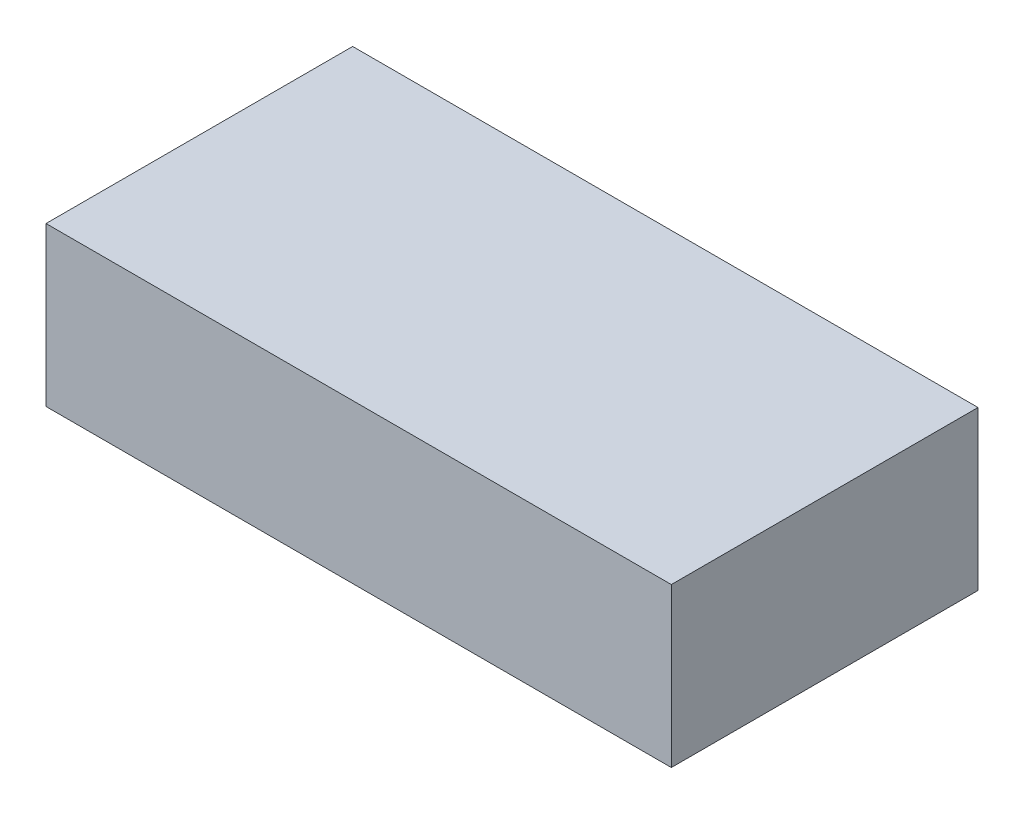
ISO-10303-21;
HEADER;
FILE_DESCRIPTION(('STEP AP214'),'2;1');
FILE_NAME('part.step','',(''),(''),'','','');
FILE_SCHEMA(('AUTOMOTIVE_DESIGN { 1 0 10303 214 1 1 1 1 }'));
ENDSEC;
DATA;
#1=APPLICATION_CONTEXT('core data for automotive mechanical design processes');
#2=APPLICATION_PROTOCOL_DEFINITION('international standard','automotive_design',2000,#1);
#3=PRODUCT_CONTEXT('',#1,'mechanical');
#4=PRODUCT('Part','Part','',(#3));
#5=PRODUCT_RELATED_PRODUCT_CATEGORY('part','',(#4));
#6=PRODUCT_DEFINITION_FORMATION('','',#4);
#7=PRODUCT_DEFINITION_CONTEXT('part definition',#1,'design');
#8=PRODUCT_DEFINITION('design','',#6,#7);
#9=PRODUCT_DEFINITION_SHAPE('','',#8);
#10=(LENGTH_UNIT() NAMED_UNIT(*) SI_UNIT(.MILLI.,.METRE.));
#11=(NAMED_UNIT(*) PLANE_ANGLE_UNIT() SI_UNIT($,.RADIAN.));
#12=(NAMED_UNIT(*) SI_UNIT($,.STERADIAN.) SOLID_ANGLE_UNIT());
#13=UNCERTAINTY_MEASURE_WITH_UNIT(LENGTH_MEASURE(1.E-05),#10,'distance_accuracy_value','');
#14=(GEOMETRIC_REPRESENTATION_CONTEXT(3) GLOBAL_UNCERTAINTY_ASSIGNED_CONTEXT((#13)) GLOBAL_UNIT_ASSIGNED_CONTEXT((#10,
#11,#12)) REPRESENTATION_CONTEXT('',''));
#15=CARTESIAN_POINT('',(0.,0.,0.));
#16=DIRECTION('',(0.,0.,1.));
#17=DIRECTION('',(1.,0.,0.));
#18=AXIS2_PLACEMENT_3D('',#15,#16,#17);
#19=CARTESIAN_POINT('',(-59.1844129893904,30.,-29.0243389926648));
#20=DIRECTION('',(1.,0.,0.));
#21=DIRECTION('',(0.,0.,-1.));
#22=AXIS2_PLACEMENT_3D('',#19,#20,#21);
#23=PLANE('',#22);
#24=DIRECTION('',(0.,0.,1.));
#25=VECTOR('',#24,1.);
#26=CARTESIAN_POINT('',(-59.1844129893904,0.,-29.0243389926648));
#27=LINE('',#26,#25);
#28=CARTESIAN_POINT('',(-59.1844129893904,0.,-29.0243389926648));
#29=VERTEX_POINT('',#28);
#30=CARTESIAN_POINT('',(-59.1844129893904,0.,29.0243389926648));
#31=VERTEX_POINT('',#30);
#32=EDGE_CURVE('E96',#29,#31,#27,.T.);
#33=ORIENTED_EDGE('',*,*,#32,.T.);
#34=DIRECTION('',(0.,-1.,0.));
#35=VECTOR('',#34,1.);
#36=CARTESIAN_POINT('',(-59.1844129893904,30.,29.0243389926648));
#37=LINE('',#36,#35);
#38=CARTESIAN_POINT('',(-59.1844129893904,30.,29.0243389926648));
#39=VERTEX_POINT('',#38);
#40=EDGE_CURVE('E11',#39,#31,#37,.T.);
#41=ORIENTED_EDGE('',*,*,#40,.F.);
#42=DIRECTION('',(0.,0.,1.));
#43=VECTOR('',#42,1.);
#44=CARTESIAN_POINT('',(-59.1844129893904,30.,-29.0243389926648));
#45=LINE('',#44,#43);
#46=CARTESIAN_POINT('',(-59.1844129893904,30.,-29.0243389926648));
#47=VERTEX_POINT('',#46);
#48=EDGE_CURVE('E84',#47,#39,#45,.T.);
#49=ORIENTED_EDGE('',*,*,#48,.F.);
#50=DIRECTION('',(0.,-1.,0.));
#51=VECTOR('',#50,1.);
#52=CARTESIAN_POINT('',(-59.1844129893904,30.,-29.0243389926648));
#53=LINE('',#52,#51);
#54=EDGE_CURVE('E92',#47,#29,#53,.T.);
#55=ORIENTED_EDGE('',*,*,#54,.T.);
#56=EDGE_LOOP('',(#33,#41,#49,#55));
#57=FACE_BOUND('',#56,.T.);
#58=ADVANCED_FACE('F33',(#57),#23,.F.);
#59=CARTESIAN_POINT('',(-59.1844129893904,30.,29.0243389926648));
#60=DIRECTION('',(0.,0.,-1.));
#61=DIRECTION('',(-1.,0.,0.));
#62=AXIS2_PLACEMENT_3D('',#59,#60,#61);
#63=PLANE('',#62);
#64=DIRECTION('',(1.,0.,0.));
#65=VECTOR('',#64,1.);
#66=CARTESIAN_POINT('',(-59.1844129893904,0.,29.0243389926648));
#67=LINE('',#66,#65);
#68=CARTESIAN_POINT('',(59.1844129893904,0.,29.0243389926648));
#69=VERTEX_POINT('',#68);
#70=EDGE_CURVE('E88',#31,#69,#67,.T.);
#71=ORIENTED_EDGE('',*,*,#70,.T.);
#72=DIRECTION('',(0.,-1.,0.));
#73=VECTOR('',#72,1.);
#74=CARTESIAN_POINT('',(59.1844129893904,30.,29.0243389926648));
#75=LINE('',#74,#73);
#76=CARTESIAN_POINT('',(59.1844129893904,30.,29.0243389926648));
#77=VERTEX_POINT('',#76);
#78=EDGE_CURVE('E41',#77,#69,#75,.T.);
#79=ORIENTED_EDGE('',*,*,#78,.F.);
#80=DIRECTION('',(1.,0.,0.));
#81=VECTOR('',#80,1.);
#82=CARTESIAN_POINT('',(-59.1844129893904,30.,29.0243389926648));
#83=LINE('',#82,#81);
#84=EDGE_CURVE('E79',#39,#77,#83,.T.);
#85=ORIENTED_EDGE('',*,*,#84,.F.);
#86=ORIENTED_EDGE('',*,*,#40,.T.);
#87=EDGE_LOOP('',(#71,#79,#85,#86));
#88=FACE_BOUND('',#87,.T.);
#89=ADVANCED_FACE('F87',(#88),#63,.F.);
#90=CARTESIAN_POINT('',(59.1844129893904,30.,-29.0243389926648));
#91=DIRECTION('',(-1.,0.,0.));
#92=DIRECTION('',(0.,0.,1.));
#93=AXIS2_PLACEMENT_3D('',#90,#91,#92);
#94=PLANE('',#93);
#95=DIRECTION('',(0.,0.,-1.));
#96=VECTOR('',#95,1.);
#97=CARTESIAN_POINT('',(59.1844129893904,0.,-29.0243389926648));
#98=LINE('',#97,#96);
#99=CARTESIAN_POINT('',(59.1844129893904,0.,-29.0243389926648));
#100=VERTEX_POINT('',#99);
#101=EDGE_CURVE('E66',#69,#100,#98,.T.);
#102=ORIENTED_EDGE('',*,*,#101,.T.);
#103=DIRECTION('',(0.,-1.,0.));
#104=VECTOR('',#103,1.);
#105=CARTESIAN_POINT('',(59.1844129893904,30.,-29.0243389926648));
#106=LINE('',#105,#104);
#107=CARTESIAN_POINT('',(59.1844129893904,30.,-29.0243389926648));
#108=VERTEX_POINT('',#107);
#109=EDGE_CURVE('E89',#108,#100,#106,.T.);
#110=ORIENTED_EDGE('',*,*,#109,.F.);
#111=DIRECTION('',(0.,0.,-1.));
#112=VECTOR('',#111,1.);
#113=CARTESIAN_POINT('',(59.1844129893904,30.,-29.0243389926648));
#114=LINE('',#113,#112);
#115=EDGE_CURVE('E82',#77,#108,#114,.T.);
#116=ORIENTED_EDGE('',*,*,#115,.F.);
#117=ORIENTED_EDGE('',*,*,#78,.T.);
#118=EDGE_LOOP('',(#102,#110,#116,#117));
#119=FACE_BOUND('',#118,.T.);
#120=ADVANCED_FACE('F90',(#119),#94,.F.);
#121=CARTESIAN_POINT('',(-59.1844129893904,30.,-29.0243389926648));
#122=DIRECTION('',(0.,0.,1.));
#123=DIRECTION('',(1.,0.,0.));
#124=AXIS2_PLACEMENT_3D('',#121,#122,#123);
#125=PLANE('',#124);
#126=DIRECTION('',(-1.,0.,0.));
#127=VECTOR('',#126,1.);
#128=CARTESIAN_POINT('',(-59.1844129893904,0.,-29.0243389926648));
#129=LINE('',#128,#127);
#130=EDGE_CURVE('E72',#100,#29,#129,.T.);
#131=ORIENTED_EDGE('',*,*,#130,.T.);
#132=ORIENTED_EDGE('',*,*,#54,.F.);
#133=DIRECTION('',(-1.,0.,0.));
#134=VECTOR('',#133,1.);
#135=CARTESIAN_POINT('',(-59.1844129893904,30.,-29.0243389926648));
#136=LINE('',#135,#134);
#137=EDGE_CURVE('E49',#108,#47,#136,.T.);
#138=ORIENTED_EDGE('',*,*,#137,.F.);
#139=ORIENTED_EDGE('',*,*,#109,.T.);
#140=EDGE_LOOP('',(#131,#132,#138,#139));
#141=FACE_BOUND('',#140,.T.);
#142=ADVANCED_FACE('F103',(#141),#125,.F.);
#143=CARTESIAN_POINT('',(0.,30.,0.));
#144=DIRECTION('',(0.,1.,0.));
#145=DIRECTION('',(0.,0.,1.));
#146=AXIS2_PLACEMENT_3D('',#143,#144,#145);
#147=PLANE('',#146);
#148=ORIENTED_EDGE('',*,*,#48,.T.);
#149=ORIENTED_EDGE('',*,*,#84,.T.);
#150=ORIENTED_EDGE('',*,*,#115,.T.);
#151=ORIENTED_EDGE('',*,*,#137,.T.);
#152=EDGE_LOOP('',(#148,#149,#150,#151));
#153=FACE_BOUND('',#152,.T.);
#154=ADVANCED_FACE('F80',(#153),#147,.T.);
#155=CARTESIAN_POINT('',(0.,0.,0.));
#156=DIRECTION('',(0.,1.,0.));
#157=DIRECTION('',(0.,0.,1.));
#158=AXIS2_PLACEMENT_3D('',#155,#156,#157);
#159=PLANE('',#158);
#160=ORIENTED_EDGE('',*,*,#32,.F.);
#161=ORIENTED_EDGE('',*,*,#130,.F.);
#162=ORIENTED_EDGE('',*,*,#101,.F.);
#163=ORIENTED_EDGE('',*,*,#70,.F.);
#164=EDGE_LOOP('',(#160,#161,#162,#163));
#165=FACE_BOUND('',#164,.T.);
#166=ADVANCED_FACE('F106',(#165),#159,.F.);
#167=CLOSED_SHELL('',(#58,#89,#120,#142,#154,#166));
#168=MANIFOLD_SOLID_BREP('B2',#167);
#169=ADVANCED_BREP_SHAPE_REPRESENTATION('',(#18,#168),#14);
#170=SHAPE_DEFINITION_REPRESENTATION(#9,#169);
ENDSEC;
END-ISO-10303-21;
